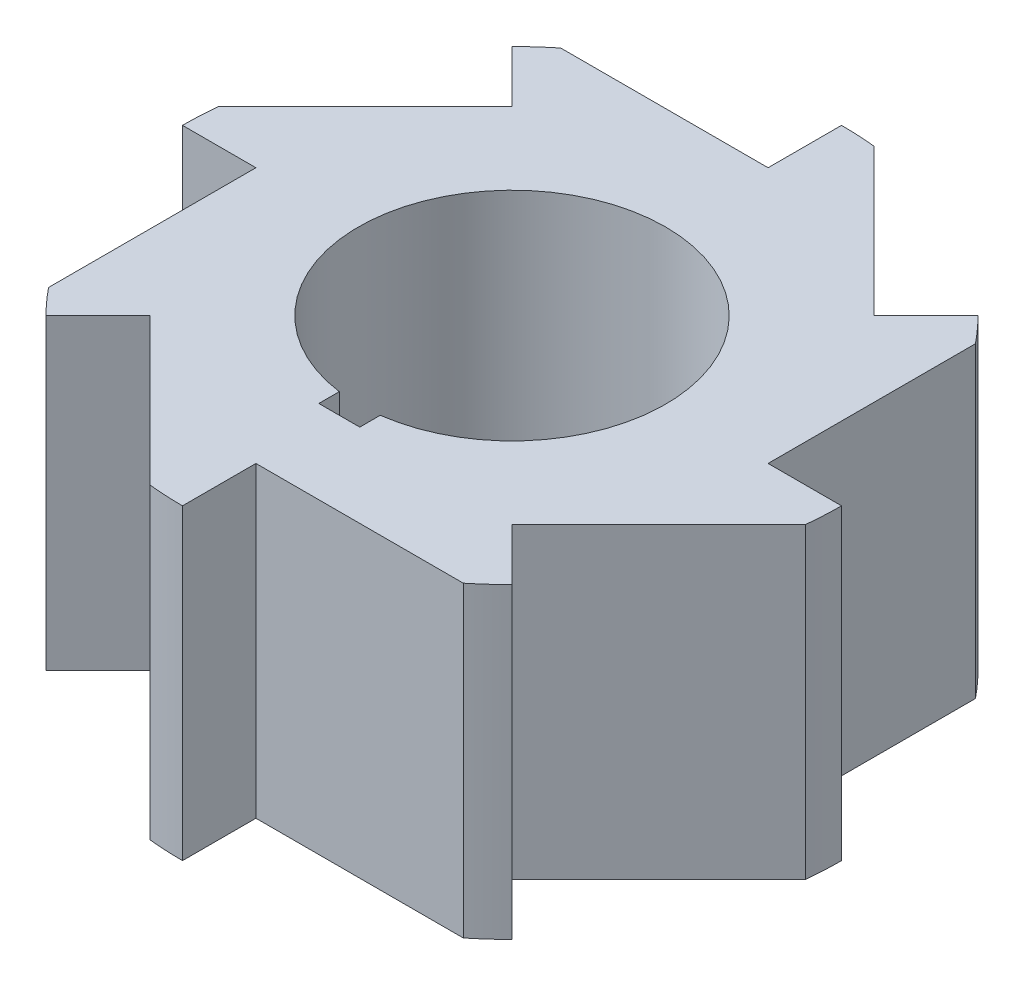
ISO-10303-21;
HEADER;
FILE_DESCRIPTION(('STEP AP214'),'2;1');
FILE_NAME('part.step','',(''),(''),'','','');
FILE_SCHEMA(('AUTOMOTIVE_DESIGN { 1 0 10303 214 1 1 1 1 }'));
ENDSEC;
DATA;
#1=APPLICATION_CONTEXT('core data for automotive mechanical design processes');
#2=APPLICATION_PROTOCOL_DEFINITION('international standard','automotive_design',2000,#1);
#3=PRODUCT_CONTEXT('',#1,'mechanical');
#4=PRODUCT('Part','Part','',(#3));
#5=PRODUCT_RELATED_PRODUCT_CATEGORY('part','',(#4));
#6=PRODUCT_DEFINITION_FORMATION('','',#4);
#7=PRODUCT_DEFINITION_CONTEXT('part definition',#1,'design');
#8=PRODUCT_DEFINITION('design','',#6,#7);
#9=PRODUCT_DEFINITION_SHAPE('','',#8);
#10=(LENGTH_UNIT() NAMED_UNIT(*) SI_UNIT(.MILLI.,.METRE.));
#11=(NAMED_UNIT(*) PLANE_ANGLE_UNIT() SI_UNIT($,.RADIAN.));
#12=(NAMED_UNIT(*) SI_UNIT($,.STERADIAN.) SOLID_ANGLE_UNIT());
#13=UNCERTAINTY_MEASURE_WITH_UNIT(LENGTH_MEASURE(1.E-05),#10,'distance_accuracy_value','');
#14=(GEOMETRIC_REPRESENTATION_CONTEXT(3) GLOBAL_UNCERTAINTY_ASSIGNED_CONTEXT((#13)) GLOBAL_UNIT_ASSIGNED_CONTEXT((#10,
#11,#12)) REPRESENTATION_CONTEXT('',''));
#15=CARTESIAN_POINT('',(0.,0.,0.));
#16=DIRECTION('',(0.,0.,1.));
#17=DIRECTION('',(1.,0.,0.));
#18=AXIS2_PLACEMENT_3D('',#15,#16,#17);
#19=CARTESIAN_POINT('',(0.,30.,0.));
#20=DIRECTION('',(0.,1.,0.));
#21=DIRECTION('',(0.,0.,1.));
#22=AXIS2_PLACEMENT_3D('',#19,#20,#21);
#23=PLANE('',#22);
#24=DIRECTION('',(1.,0.,0.));
#25=VECTOR('',#24,1.);
#26=CARTESIAN_POINT('',(20.2435385717473,30.,25.));
#27=LINE('',#26,#25);
#28=CARTESIAN_POINT('',(0.,30.,25.));
#29=VERTEX_POINT('',#28);
#30=CARTESIAN_POINT('',(20.2435385717473,30.,25.));
#31=VERTEX_POINT('',#30);
#32=EDGE_CURVE('E283',#29,#31,#27,.T.);
#33=ORIENTED_EDGE('',*,*,#32,.T.);
#34=CARTESIAN_POINT('',(0.,30.,0.));
#35=DIRECTION('',(0.,1.,0.));
#36=DIRECTION('',(0.,0.,1.));
#37=AXIS2_PLACEMENT_3D('',#34,#35,#36);
#38=CIRCLE('',#37,32.1683206572215);
#39=CARTESIAN_POINT('',(22.7464376761046,30.,22.7464376761046));
#40=VERTEX_POINT('',#39);
#41=EDGE_CURVE('E287',#31,#40,#38,.T.);
#42=ORIENTED_EDGE('',*,*,#41,.T.);
#43=DIRECTION('',(-0.707106781186548,0.,-0.707106781186547));
#44=VECTOR('',#43,1.);
#45=CARTESIAN_POINT('',(17.6776695296637,30.,17.6776695296637));
#46=LINE('',#45,#44);
#47=CARTESIAN_POINT('',(17.6776695296637,30.,17.6776695296637));
#48=VERTEX_POINT('',#47);
#49=EDGE_CURVE('E291',#40,#48,#46,.T.);
#50=ORIENTED_EDGE('',*,*,#49,.T.);
#51=DIRECTION('',(0.707106781186548,0.,-0.707106781186547));
#52=VECTOR('',#51,1.);
#53=CARTESIAN_POINT('',(31.9920129289576,30.,3.36332613036975));
#54=LINE('',#53,#52);
#55=CARTESIAN_POINT('',(31.9920129289576,30.,3.36332613036975));
#56=VERTEX_POINT('',#55);
#57=EDGE_CURVE('E294',#48,#56,#54,.T.);
#58=ORIENTED_EDGE('',*,*,#57,.T.);
#59=CARTESIAN_POINT('',(0.,30.,0.));
#60=DIRECTION('',(0.,1.,0.));
#61=DIRECTION('',(0.,0.,1.));
#62=AXIS2_PLACEMENT_3D('',#59,#60,#61);
#63=CIRCLE('',#62,32.1683206572215);
#64=CARTESIAN_POINT('',(32.1683206572215,30.,0.));
#65=VERTEX_POINT('',#64);
#66=EDGE_CURVE('E297',#56,#65,#63,.T.);
#67=ORIENTED_EDGE('',*,*,#66,.T.);
#68=DIRECTION('',(-1.,0.,0.));
#69=VECTOR('',#68,1.);
#70=CARTESIAN_POINT('',(25.,30.,0.));
#71=LINE('',#70,#69);
#72=CARTESIAN_POINT('',(25.,30.,0.));
#73=VERTEX_POINT('',#72);
#74=EDGE_CURVE('E300',#65,#73,#71,.T.);
#75=ORIENTED_EDGE('',*,*,#74,.T.);
#76=DIRECTION('',(0.,0.,-1.));
#77=VECTOR('',#76,1.);
#78=CARTESIAN_POINT('',(25.,30.,-20.2435385717473));
#79=LINE('',#78,#77);
#80=CARTESIAN_POINT('',(25.,30.,-20.2435385717473));
#81=VERTEX_POINT('',#80);
#82=EDGE_CURVE('E303',#73,#81,#79,.T.);
#83=ORIENTED_EDGE('',*,*,#82,.T.);
#84=CARTESIAN_POINT('',(0.,30.,0.));
#85=DIRECTION('',(0.,1.,0.));
#86=DIRECTION('',(0.,0.,1.));
#87=AXIS2_PLACEMENT_3D('',#84,#85,#86);
#88=CIRCLE('',#87,32.1683206572215);
#89=CARTESIAN_POINT('',(22.7464376761046,30.,-22.7464376761046));
#90=VERTEX_POINT('',#89);
#91=EDGE_CURVE('E306',#81,#90,#88,.T.);
#92=ORIENTED_EDGE('',*,*,#91,.T.);
#93=DIRECTION('',(-0.707106781186547,0.,0.707106781186549));
#94=VECTOR('',#93,1.);
#95=CARTESIAN_POINT('',(17.6776695296637,30.,-17.6776695296637));
#96=LINE('',#95,#94);
#97=CARTESIAN_POINT('',(17.6776695296637,30.,-17.6776695296637));
#98=VERTEX_POINT('',#97);
#99=EDGE_CURVE('E309',#90,#98,#96,.T.);
#100=ORIENTED_EDGE('',*,*,#99,.T.);
#101=DIRECTION('',(-0.707106781186547,0.,-0.707106781186548));
#102=VECTOR('',#101,1.);
#103=CARTESIAN_POINT('',(3.36332613036975,30.,-31.9920129289576));
#104=LINE('',#103,#102);
#105=CARTESIAN_POINT('',(3.36332613036975,30.,-31.9920129289576));
#106=VERTEX_POINT('',#105);
#107=EDGE_CURVE('E312',#98,#106,#104,.T.);
#108=ORIENTED_EDGE('',*,*,#107,.T.);
#109=CARTESIAN_POINT('',(0.,30.,0.));
#110=DIRECTION('',(0.,1.,0.));
#111=DIRECTION('',(0.,0.,1.));
#112=AXIS2_PLACEMENT_3D('',#109,#110,#111);
#113=CIRCLE('',#112,32.1683206572215);
#114=CARTESIAN_POINT('',(0.,30.,-32.1683206572215));
#115=VERTEX_POINT('',#114);
#116=EDGE_CURVE('E315',#106,#115,#113,.T.);
#117=ORIENTED_EDGE('',*,*,#116,.T.);
#118=DIRECTION('',(0.,0.,1.));
#119=VECTOR('',#118,1.);
#120=CARTESIAN_POINT('',(0.,30.,-25.));
#121=LINE('',#120,#119);
#122=CARTESIAN_POINT('',(0.,30.,-25.));
#123=VERTEX_POINT('',#122);
#124=EDGE_CURVE('E318',#115,#123,#121,.T.);
#125=ORIENTED_EDGE('',*,*,#124,.T.);
#126=DIRECTION('',(-1.,0.,0.));
#127=VECTOR('',#126,1.);
#128=CARTESIAN_POINT('',(-20.2435385717473,30.,-25.));
#129=LINE('',#128,#127);
#130=CARTESIAN_POINT('',(-20.2435385717473,30.,-25.));
#131=VERTEX_POINT('',#130);
#132=EDGE_CURVE('E321',#123,#131,#129,.T.);
#133=ORIENTED_EDGE('',*,*,#132,.T.);
#134=CARTESIAN_POINT('',(0.,30.,0.));
#135=DIRECTION('',(0.,1.,0.));
#136=DIRECTION('',(0.,0.,1.));
#137=AXIS2_PLACEMENT_3D('',#134,#135,#136);
#138=CIRCLE('',#137,32.1683206572215);
#139=CARTESIAN_POINT('',(-22.7464376761046,30.,-22.7464376761046));
#140=VERTEX_POINT('',#139);
#141=EDGE_CURVE('E324',#131,#140,#138,.T.);
#142=ORIENTED_EDGE('',*,*,#141,.T.);
#143=DIRECTION('',(0.707106781186548,0.,0.707106781186547));
#144=VECTOR('',#143,1.);
#145=CARTESIAN_POINT('',(-17.6776695296637,30.,-17.6776695296637));
#146=LINE('',#145,#144);
#147=CARTESIAN_POINT('',(-17.6776695296637,30.,-17.6776695296637));
#148=VERTEX_POINT('',#147);
#149=EDGE_CURVE('E327',#140,#148,#146,.T.);
#150=ORIENTED_EDGE('',*,*,#149,.T.);
#151=DIRECTION('',(-0.707106781186548,0.,0.707106781186547));
#152=VECTOR('',#151,1.);
#153=CARTESIAN_POINT('',(-31.9920129289576,30.,-3.36332613036975));
#154=LINE('',#153,#152);
#155=CARTESIAN_POINT('',(-31.9920129289576,30.,-3.36332613036974));
#156=VERTEX_POINT('',#155);
#157=EDGE_CURVE('E330',#148,#156,#154,.T.);
#158=ORIENTED_EDGE('',*,*,#157,.T.);
#159=CARTESIAN_POINT('',(0.,30.,0.));
#160=DIRECTION('',(0.,1.,0.));
#161=DIRECTION('',(0.,0.,1.));
#162=AXIS2_PLACEMENT_3D('',#159,#160,#161);
#163=CIRCLE('',#162,32.1683206572215);
#164=CARTESIAN_POINT('',(-32.1683206572215,30.,0.));
#165=VERTEX_POINT('',#164);
#166=EDGE_CURVE('E333',#156,#165,#163,.T.);
#167=ORIENTED_EDGE('',*,*,#166,.T.);
#168=DIRECTION('',(1.,0.,0.));
#169=VECTOR('',#168,1.);
#170=CARTESIAN_POINT('',(-25.,30.,0.));
#171=LINE('',#170,#169);
#172=CARTESIAN_POINT('',(-25.,30.,0.));
#173=VERTEX_POINT('',#172);
#174=EDGE_CURVE('E336',#165,#173,#171,.T.);
#175=ORIENTED_EDGE('',*,*,#174,.T.);
#176=DIRECTION('',(0.,0.,1.));
#177=VECTOR('',#176,1.);
#178=CARTESIAN_POINT('',(-25.,30.,20.2435385717473));
#179=LINE('',#178,#177);
#180=CARTESIAN_POINT('',(-25.,30.,20.2435385717473));
#181=VERTEX_POINT('',#180);
#182=EDGE_CURVE('E339',#173,#181,#179,.T.);
#183=ORIENTED_EDGE('',*,*,#182,.T.);
#184=CARTESIAN_POINT('',(0.,30.,0.));
#185=DIRECTION('',(0.,1.,0.));
#186=DIRECTION('',(0.,0.,1.));
#187=AXIS2_PLACEMENT_3D('',#184,#185,#186);
#188=CIRCLE('',#187,32.1683206572215);
#189=CARTESIAN_POINT('',(-22.7464376761046,30.,22.7464376761046));
#190=VERTEX_POINT('',#189);
#191=EDGE_CURVE('E342',#181,#190,#188,.T.);
#192=ORIENTED_EDGE('',*,*,#191,.T.);
#193=DIRECTION('',(0.707106781186545,0.,-0.70710678118655));
#194=VECTOR('',#193,1.);
#195=CARTESIAN_POINT('',(-17.6776695296637,30.,17.6776695296637));
#196=LINE('',#195,#194);
#197=CARTESIAN_POINT('',(-17.6776695296637,30.,17.6776695296637));
#198=VERTEX_POINT('',#197);
#199=EDGE_CURVE('E345',#190,#198,#196,.T.);
#200=ORIENTED_EDGE('',*,*,#199,.T.);
#201=DIRECTION('',(0.707106781186547,0.,0.707106781186548));
#202=VECTOR('',#201,1.);
#203=CARTESIAN_POINT('',(-3.36332613036975,30.,31.9920129289576));
#204=LINE('',#203,#202);
#205=CARTESIAN_POINT('',(-3.36332613036974,30.,31.9920129289576));
#206=VERTEX_POINT('',#205);
#207=EDGE_CURVE('E348',#198,#206,#204,.T.);
#208=ORIENTED_EDGE('',*,*,#207,.T.);
#209=CARTESIAN_POINT('',(0.,30.,0.));
#210=DIRECTION('',(0.,1.,0.));
#211=DIRECTION('',(0.,0.,1.));
#212=AXIS2_PLACEMENT_3D('',#209,#210,#211);
#213=CIRCLE('',#212,32.1683206572215);
#214=CARTESIAN_POINT('',(0.,30.,32.1683206572215));
#215=VERTEX_POINT('',#214);
#216=EDGE_CURVE('E351',#206,#215,#213,.T.);
#217=ORIENTED_EDGE('',*,*,#216,.T.);
#218=DIRECTION('',(0.,0.,-1.));
#219=VECTOR('',#218,1.);
#220=CARTESIAN_POINT('',(0.,30.,25.));
#221=LINE('',#220,#219);
#222=EDGE_CURVE('E354',#215,#29,#221,.T.);
#223=ORIENTED_EDGE('',*,*,#222,.T.);
#224=EDGE_LOOP('',(#33,#42,#50,#58,#67,#75,#83,#92,#100,#108,#117,#125,#133,#142,#150,#158,#167,
#175,#183,#192,#200,#208,#217,#223));
#225=FACE_BOUND('',#224,.T.);
#226=DIRECTION('',(0.,0.,-1.));
#227=VECTOR('',#226,1.);
#228=CARTESIAN_POINT('',(2.,30.,16.8607427142418));
#229=LINE('',#228,#227);
#230=CARTESIAN_POINT('',(2.,30.,16.8607427142418));
#231=VERTEX_POINT('',#230);
#232=CARTESIAN_POINT('',(2.,30.,14.8607427142417));
#233=VERTEX_POINT('',#232);
#234=EDGE_CURVE('E244',#231,#233,#229,.T.);
#235=ORIENTED_EDGE('',*,*,#234,.F.);
#236=DIRECTION('',(1.,0.,0.));
#237=VECTOR('',#236,1.);
#238=CARTESIAN_POINT('',(-2.,30.,16.8607427142418));
#239=LINE('',#238,#237);
#240=CARTESIAN_POINT('',(-2.,30.,16.8607427142418));
#241=VERTEX_POINT('',#240);
#242=EDGE_CURVE('E235',#241,#231,#239,.T.);
#243=ORIENTED_EDGE('',*,*,#242,.F.);
#244=DIRECTION('',(0.,0.,1.));
#245=VECTOR('',#244,1.);
#246=CARTESIAN_POINT('',(-2.,30.,16.8607427142418));
#247=LINE('',#246,#245);
#248=CARTESIAN_POINT('',(-2.,30.,14.8607427142418));
#249=VERTEX_POINT('',#248);
#250=EDGE_CURVE('E261',#249,#241,#247,.T.);
#251=ORIENTED_EDGE('',*,*,#250,.F.);
#252=CARTESIAN_POINT('',(0.,30.,0.));
#253=DIRECTION('',(0.,1.,0.));
#254=DIRECTION('',(0.,0.,1.));
#255=AXIS2_PLACEMENT_3D('',#252,#253,#254);
#256=CIRCLE('',#255,14.9947215385578);
#257=EDGE_CURVE('E257',#233,#249,#256,.T.);
#258=ORIENTED_EDGE('',*,*,#257,.F.);
#259=EDGE_LOOP('',(#235,#243,#251,#258));
#260=FACE_BOUND('',#259,.T.);
#261=ADVANCED_FACE('F49',(#225,#260),#23,.T.);
#262=CARTESIAN_POINT('',(0.,0.,0.));
#263=DIRECTION('',(0.,1.,0.));
#264=DIRECTION('',(0.,0.,1.));
#265=AXIS2_PLACEMENT_3D('',#262,#263,#264);
#266=PLANE('',#265);
#267=DIRECTION('',(1.,0.,0.));
#268=VECTOR('',#267,1.);
#269=CARTESIAN_POINT('',(20.2435385717473,0.,25.));
#270=LINE('',#269,#268);
#271=CARTESIAN_POINT('',(0.,0.,25.));
#272=VERTEX_POINT('',#271);
#273=CARTESIAN_POINT('',(20.2435385717473,0.,25.));
#274=VERTEX_POINT('',#273);
#275=EDGE_CURVE('E253',#272,#274,#270,.T.);
#276=ORIENTED_EDGE('',*,*,#275,.F.);
#277=DIRECTION('',(0.,0.,-1.));
#278=VECTOR('',#277,1.);
#279=CARTESIAN_POINT('',(0.,0.,25.));
#280=LINE('',#279,#278);
#281=CARTESIAN_POINT('',(0.,0.,32.1683206572215));
#282=VERTEX_POINT('',#281);
#283=EDGE_CURVE('E288',#282,#272,#280,.T.);
#284=ORIENTED_EDGE('',*,*,#283,.F.);
#285=CARTESIAN_POINT('',(0.,0.,0.));
#286=DIRECTION('',(0.,1.,0.));
#287=DIRECTION('',(0.,0.,1.));
#288=AXIS2_PLACEMENT_3D('',#285,#286,#287);
#289=CIRCLE('',#288,32.1683206572215);
#290=CARTESIAN_POINT('',(-3.36332613036974,0.,31.9920129289576));
#291=VERTEX_POINT('',#290);
#292=EDGE_CURVE('E424',#291,#282,#289,.T.);
#293=ORIENTED_EDGE('',*,*,#292,.F.);
#294=DIRECTION('',(0.707106781186547,0.,0.707106781186548));
#295=VECTOR('',#294,1.);
#296=CARTESIAN_POINT('',(-3.36332613036975,0.,31.9920129289576));
#297=LINE('',#296,#295);
#298=CARTESIAN_POINT('',(-17.6776695296637,0.,17.6776695296637));
#299=VERTEX_POINT('',#298);
#300=EDGE_CURVE('E421',#299,#291,#297,.T.);
#301=ORIENTED_EDGE('',*,*,#300,.F.);
#302=DIRECTION('',(0.707106781186545,0.,-0.70710678118655));
#303=VECTOR('',#302,1.);
#304=CARTESIAN_POINT('',(-17.6776695296637,0.,17.6776695296637));
#305=LINE('',#304,#303);
#306=CARTESIAN_POINT('',(-22.7464376761046,0.,22.7464376761046));
#307=VERTEX_POINT('',#306);
#308=EDGE_CURVE('E418',#307,#299,#305,.T.);
#309=ORIENTED_EDGE('',*,*,#308,.F.);
#310=CARTESIAN_POINT('',(0.,0.,0.));
#311=DIRECTION('',(0.,1.,0.));
#312=DIRECTION('',(0.,0.,1.));
#313=AXIS2_PLACEMENT_3D('',#310,#311,#312);
#314=CIRCLE('',#313,32.1683206572215);
#315=CARTESIAN_POINT('',(-25.,0.,20.2435385717473));
#316=VERTEX_POINT('',#315);
#317=EDGE_CURVE('E415',#316,#307,#314,.T.);
#318=ORIENTED_EDGE('',*,*,#317,.F.);
#319=DIRECTION('',(0.,0.,1.));
#320=VECTOR('',#319,1.);
#321=CARTESIAN_POINT('',(-25.,0.,20.2435385717473));
#322=LINE('',#321,#320);
#323=CARTESIAN_POINT('',(-25.,0.,0.));
#324=VERTEX_POINT('',#323);
#325=EDGE_CURVE('E412',#324,#316,#322,.T.);
#326=ORIENTED_EDGE('',*,*,#325,.F.);
#327=DIRECTION('',(1.,0.,0.));
#328=VECTOR('',#327,1.);
#329=CARTESIAN_POINT('',(-25.,0.,0.));
#330=LINE('',#329,#328);
#331=CARTESIAN_POINT('',(-32.1683206572215,0.,0.));
#332=VERTEX_POINT('',#331);
#333=EDGE_CURVE('E409',#332,#324,#330,.T.);
#334=ORIENTED_EDGE('',*,*,#333,.F.);
#335=CARTESIAN_POINT('',(0.,0.,0.));
#336=DIRECTION('',(0.,1.,0.));
#337=DIRECTION('',(0.,0.,1.));
#338=AXIS2_PLACEMENT_3D('',#335,#336,#337);
#339=CIRCLE('',#338,32.1683206572215);
#340=CARTESIAN_POINT('',(-31.9920129289576,0.,-3.36332613036974));
#341=VERTEX_POINT('',#340);
#342=EDGE_CURVE('E406',#341,#332,#339,.T.);
#343=ORIENTED_EDGE('',*,*,#342,.F.);
#344=DIRECTION('',(-0.707106781186548,0.,0.707106781186547));
#345=VECTOR('',#344,1.);
#346=CARTESIAN_POINT('',(-31.9920129289576,0.,-3.36332613036975));
#347=LINE('',#346,#345);
#348=CARTESIAN_POINT('',(-17.6776695296637,0.,-17.6776695296637));
#349=VERTEX_POINT('',#348);
#350=EDGE_CURVE('E403',#349,#341,#347,.T.);
#351=ORIENTED_EDGE('',*,*,#350,.F.);
#352=DIRECTION('',(0.707106781186548,0.,0.707106781186547));
#353=VECTOR('',#352,1.);
#354=CARTESIAN_POINT('',(-17.6776695296637,0.,-17.6776695296637));
#355=LINE('',#354,#353);
#356=CARTESIAN_POINT('',(-22.7464376761046,0.,-22.7464376761046));
#357=VERTEX_POINT('',#356);
#358=EDGE_CURVE('E400',#357,#349,#355,.T.);
#359=ORIENTED_EDGE('',*,*,#358,.F.);
#360=CARTESIAN_POINT('',(0.,0.,0.));
#361=DIRECTION('',(0.,1.,0.));
#362=DIRECTION('',(0.,0.,1.));
#363=AXIS2_PLACEMENT_3D('',#360,#361,#362);
#364=CIRCLE('',#363,32.1683206572215);
#365=CARTESIAN_POINT('',(-20.2435385717473,0.,-25.));
#366=VERTEX_POINT('',#365);
#367=EDGE_CURVE('E397',#366,#357,#364,.T.);
#368=ORIENTED_EDGE('',*,*,#367,.F.);
#369=DIRECTION('',(-1.,0.,0.));
#370=VECTOR('',#369,1.);
#371=CARTESIAN_POINT('',(-20.2435385717473,0.,-25.));
#372=LINE('',#371,#370);
#373=CARTESIAN_POINT('',(0.,0.,-25.));
#374=VERTEX_POINT('',#373);
#375=EDGE_CURVE('E394',#374,#366,#372,.T.);
#376=ORIENTED_EDGE('',*,*,#375,.F.);
#377=DIRECTION('',(0.,0.,1.));
#378=VECTOR('',#377,1.);
#379=CARTESIAN_POINT('',(0.,0.,-25.));
#380=LINE('',#379,#378);
#381=CARTESIAN_POINT('',(0.,0.,-32.1683206572215));
#382=VERTEX_POINT('',#381);
#383=EDGE_CURVE('E391',#382,#374,#380,.T.);
#384=ORIENTED_EDGE('',*,*,#383,.F.);
#385=CARTESIAN_POINT('',(0.,0.,0.));
#386=DIRECTION('',(0.,1.,0.));
#387=DIRECTION('',(0.,0.,1.));
#388=AXIS2_PLACEMENT_3D('',#385,#386,#387);
#389=CIRCLE('',#388,32.1683206572215);
#390=CARTESIAN_POINT('',(3.36332613036975,0.,-31.9920129289576));
#391=VERTEX_POINT('',#390);
#392=EDGE_CURVE('E388',#391,#382,#389,.T.);
#393=ORIENTED_EDGE('',*,*,#392,.F.);
#394=DIRECTION('',(-0.707106781186547,0.,-0.707106781186548));
#395=VECTOR('',#394,1.);
#396=CARTESIAN_POINT('',(3.36332613036975,0.,-31.9920129289576));
#397=LINE('',#396,#395);
#398=CARTESIAN_POINT('',(17.6776695296637,0.,-17.6776695296637));
#399=VERTEX_POINT('',#398);
#400=EDGE_CURVE('E385',#399,#391,#397,.T.);
#401=ORIENTED_EDGE('',*,*,#400,.F.);
#402=DIRECTION('',(-0.707106781186547,0.,0.707106781186549));
#403=VECTOR('',#402,1.);
#404=CARTESIAN_POINT('',(17.6776695296637,0.,-17.6776695296637));
#405=LINE('',#404,#403);
#406=CARTESIAN_POINT('',(22.7464376761046,0.,-22.7464376761046));
#407=VERTEX_POINT('',#406);
#408=EDGE_CURVE('E382',#407,#399,#405,.T.);
#409=ORIENTED_EDGE('',*,*,#408,.F.);
#410=CARTESIAN_POINT('',(0.,0.,0.));
#411=DIRECTION('',(0.,1.,0.));
#412=DIRECTION('',(0.,0.,1.));
#413=AXIS2_PLACEMENT_3D('',#410,#411,#412);
#414=CIRCLE('',#413,32.1683206572215);
#415=CARTESIAN_POINT('',(25.,0.,-20.2435385717473));
#416=VERTEX_POINT('',#415);
#417=EDGE_CURVE('E379',#416,#407,#414,.T.);
#418=ORIENTED_EDGE('',*,*,#417,.F.);
#419=DIRECTION('',(0.,0.,-1.));
#420=VECTOR('',#419,1.);
#421=CARTESIAN_POINT('',(25.,0.,-20.2435385717473));
#422=LINE('',#421,#420);
#423=CARTESIAN_POINT('',(25.,0.,0.));
#424=VERTEX_POINT('',#423);
#425=EDGE_CURVE('E376',#424,#416,#422,.T.);
#426=ORIENTED_EDGE('',*,*,#425,.F.);
#427=DIRECTION('',(-1.,0.,0.));
#428=VECTOR('',#427,1.);
#429=CARTESIAN_POINT('',(25.,0.,0.));
#430=LINE('',#429,#428);
#431=CARTESIAN_POINT('',(32.1683206572215,0.,0.));
#432=VERTEX_POINT('',#431);
#433=EDGE_CURVE('E373',#432,#424,#430,.T.);
#434=ORIENTED_EDGE('',*,*,#433,.F.);
#435=CARTESIAN_POINT('',(0.,0.,0.));
#436=DIRECTION('',(0.,1.,0.));
#437=DIRECTION('',(0.,0.,1.));
#438=AXIS2_PLACEMENT_3D('',#435,#436,#437);
#439=CIRCLE('',#438,32.1683206572215);
#440=CARTESIAN_POINT('',(31.9920129289576,0.,3.36332613036975));
#441=VERTEX_POINT('',#440);
#442=EDGE_CURVE('E370',#441,#432,#439,.T.);
#443=ORIENTED_EDGE('',*,*,#442,.F.);
#444=DIRECTION('',(0.707106781186548,0.,-0.707106781186547));
#445=VECTOR('',#444,1.);
#446=CARTESIAN_POINT('',(31.9920129289576,0.,3.36332613036975));
#447=LINE('',#446,#445);
#448=CARTESIAN_POINT('',(17.6776695296637,0.,17.6776695296637));
#449=VERTEX_POINT('',#448);
#450=EDGE_CURVE('E367',#449,#441,#447,.T.);
#451=ORIENTED_EDGE('',*,*,#450,.F.);
#452=DIRECTION('',(-0.707106781186548,0.,-0.707106781186547));
#453=VECTOR('',#452,1.);
#454=CARTESIAN_POINT('',(17.6776695296637,0.,17.6776695296637));
#455=LINE('',#454,#453);
#456=CARTESIAN_POINT('',(22.7464376761046,0.,22.7464376761046));
#457=VERTEX_POINT('',#456);
#458=EDGE_CURVE('E364',#457,#449,#455,.T.);
#459=ORIENTED_EDGE('',*,*,#458,.F.);
#460=CARTESIAN_POINT('',(0.,0.,0.));
#461=DIRECTION('',(0.,1.,0.));
#462=DIRECTION('',(0.,0.,1.));
#463=AXIS2_PLACEMENT_3D('',#460,#461,#462);
#464=CIRCLE('',#463,32.1683206572215);
#465=EDGE_CURVE('E361',#274,#457,#464,.T.);
#466=ORIENTED_EDGE('',*,*,#465,.F.);
#467=EDGE_LOOP('',(#276,#284,#293,#301,#309,#318,#326,#334,#343,#351,#359,#368,#376,#384,#393,
#401,#409,#418,#426,#434,#443,#451,#459,#466));
#468=FACE_BOUND('',#467,.T.);
#469=DIRECTION('',(1.,0.,0.));
#470=VECTOR('',#469,1.);
#471=CARTESIAN_POINT('',(-2.,0.,16.8607427142418));
#472=LINE('',#471,#470);
#473=CARTESIAN_POINT('',(-2.,0.,16.8607427142418));
#474=VERTEX_POINT('',#473);
#475=CARTESIAN_POINT('',(2.,0.,16.8607427142418));
#476=VERTEX_POINT('',#475);
#477=EDGE_CURVE('E73',#474,#476,#472,.T.);
#478=ORIENTED_EDGE('',*,*,#477,.T.);
#479=DIRECTION('',(0.,0.,-1.));
#480=VECTOR('',#479,1.);
#481=CARTESIAN_POINT('',(2.,0.,16.8607427142418));
#482=LINE('',#481,#480);
#483=CARTESIAN_POINT('',(2.,0.,14.8607427142417));
#484=VERTEX_POINT('',#483);
#485=EDGE_CURVE('E251',#476,#484,#482,.T.);
#486=ORIENTED_EDGE('',*,*,#485,.T.);
#487=CARTESIAN_POINT('',(0.,0.,0.));
#488=DIRECTION('',(0.,1.,0.));
#489=DIRECTION('',(0.,0.,1.));
#490=AXIS2_PLACEMENT_3D('',#487,#488,#489);
#491=CIRCLE('',#490,14.9947215385578);
#492=CARTESIAN_POINT('',(-2.,0.,14.8607427142418));
#493=VERTEX_POINT('',#492);
#494=EDGE_CURVE('E270',#484,#493,#491,.T.);
#495=ORIENTED_EDGE('',*,*,#494,.T.);
#496=DIRECTION('',(0.,0.,1.));
#497=VECTOR('',#496,1.);
#498=CARTESIAN_POINT('',(-2.,0.,16.8607427142418));
#499=LINE('',#498,#497);
#500=EDGE_CURVE('E245',#493,#474,#499,.T.);
#501=ORIENTED_EDGE('',*,*,#500,.T.);
#502=EDGE_LOOP('',(#478,#486,#495,#501));
#503=FACE_BOUND('',#502,.T.);
#504=ADVANCED_FACE('F527',(#468,#503),#266,.F.);
#505=CARTESIAN_POINT('',(20.2435385717473,30.,25.));
#506=DIRECTION('',(0.,0.,-1.));
#507=DIRECTION('',(-1.,0.,0.));
#508=AXIS2_PLACEMENT_3D('',#505,#506,#507);
#509=PLANE('',#508);
#510=ORIENTED_EDGE('',*,*,#275,.T.);
#511=DIRECTION('',(0.,-1.,0.));
#512=VECTOR('',#511,1.);
#513=CARTESIAN_POINT('',(20.2435385717473,30.,25.));
#514=LINE('',#513,#512);
#515=EDGE_CURVE('E13',#31,#274,#514,.T.);
#516=ORIENTED_EDGE('',*,*,#515,.F.);
#517=ORIENTED_EDGE('',*,*,#32,.F.);
#518=DIRECTION('',(0.,-1.,0.));
#519=VECTOR('',#518,1.);
#520=CARTESIAN_POINT('',(0.,30.,25.));
#521=LINE('',#520,#519);
#522=EDGE_CURVE('E357',#29,#272,#521,.T.);
#523=ORIENTED_EDGE('',*,*,#522,.T.);
#524=EDGE_LOOP('',(#510,#516,#517,#523));
#525=FACE_BOUND('',#524,.T.);
#526=ADVANCED_FACE('F51',(#525),#509,.F.);
#527=CARTESIAN_POINT('',(0.,30.,0.));
#528=DIRECTION('',(0.,-1.,0.));
#529=DIRECTION('',(0.,0.,-1.));
#530=AXIS2_PLACEMENT_3D('',#527,#528,#529);
#531=CYLINDRICAL_SURFACE('',#530,32.1683206572215);
#532=ORIENTED_EDGE('',*,*,#465,.T.);
#533=DIRECTION('',(0.,-1.,0.));
#534=VECTOR('',#533,1.);
#535=CARTESIAN_POINT('',(22.7464376761046,30.,22.7464376761046));
#536=LINE('',#535,#534);
#537=EDGE_CURVE('E58',#40,#457,#536,.T.);
#538=ORIENTED_EDGE('',*,*,#537,.F.);
#539=ORIENTED_EDGE('',*,*,#41,.F.);
#540=ORIENTED_EDGE('',*,*,#515,.T.);
#541=EDGE_LOOP('',(#532,#538,#539,#540));
#542=FACE_BOUND('',#541,.T.);
#543=ADVANCED_FACE('F544',(#542),#531,.T.);
#544=CARTESIAN_POINT('',(17.6776695296637,30.,17.6776695296637));
#545=DIRECTION('',(-0.707106781186547,0.,0.707106781186548));
#546=DIRECTION('',(0.707106781186548,0.,0.707106781186547));
#547=AXIS2_PLACEMENT_3D('',#544,#545,#546);
#548=PLANE('',#547);
#549=ORIENTED_EDGE('',*,*,#458,.T.);
#550=DIRECTION('',(0.,-1.,0.));
#551=VECTOR('',#550,1.);
#552=CARTESIAN_POINT('',(17.6776695296637,30.,17.6776695296637));
#553=LINE('',#552,#551);
#554=EDGE_CURVE('E512',#48,#449,#553,.T.);
#555=ORIENTED_EDGE('',*,*,#554,.F.);
#556=ORIENTED_EDGE('',*,*,#49,.F.);
#557=ORIENTED_EDGE('',*,*,#537,.T.);
#558=EDGE_LOOP('',(#549,#555,#556,#557));
#559=FACE_BOUND('',#558,.T.);
#560=ADVANCED_FACE('F521',(#559),#548,.F.);
#561=CARTESIAN_POINT('',(31.9920129289576,30.,3.36332613036975));
#562=DIRECTION('',(-0.707106781186547,0.,-0.707106781186548));
#563=DIRECTION('',(-0.707106781186548,0.,0.707106781186547));
#564=AXIS2_PLACEMENT_3D('',#561,#562,#563);
#565=PLANE('',#564);
#566=ORIENTED_EDGE('',*,*,#450,.T.);
#567=DIRECTION('',(0.,-1.,0.));
#568=VECTOR('',#567,1.);
#569=CARTESIAN_POINT('',(31.9920129289576,30.,3.36332613036975));
#570=LINE('',#569,#568);
#571=EDGE_CURVE('E508',#56,#441,#570,.T.);
#572=ORIENTED_EDGE('',*,*,#571,.F.);
#573=ORIENTED_EDGE('',*,*,#57,.F.);
#574=ORIENTED_EDGE('',*,*,#554,.T.);
#575=EDGE_LOOP('',(#566,#572,#573,#574));
#576=FACE_BOUND('',#575,.T.);
#577=ADVANCED_FACE('F533',(#576),#565,.F.);
#578=CARTESIAN_POINT('',(0.,30.,0.));
#579=DIRECTION('',(0.,-1.,0.));
#580=DIRECTION('',(0.,0.,-1.));
#581=AXIS2_PLACEMENT_3D('',#578,#579,#580);
#582=CYLINDRICAL_SURFACE('',#581,32.1683206572215);
#583=ORIENTED_EDGE('',*,*,#442,.T.);
#584=DIRECTION('',(0.,-1.,0.));
#585=VECTOR('',#584,1.);
#586=CARTESIAN_POINT('',(32.1683206572215,30.,0.));
#587=LINE('',#586,#585);
#588=EDGE_CURVE('E504',#65,#432,#587,.T.);
#589=ORIENTED_EDGE('',*,*,#588,.F.);
#590=ORIENTED_EDGE('',*,*,#66,.F.);
#591=ORIENTED_EDGE('',*,*,#571,.T.);
#592=EDGE_LOOP('',(#583,#589,#590,#591));
#593=FACE_BOUND('',#592,.T.);
#594=ADVANCED_FACE('F537',(#593),#582,.T.);
#595=CARTESIAN_POINT('',(25.,30.,0.));
#596=DIRECTION('',(0.,0.,1.));
#597=DIRECTION('',(1.,0.,0.));
#598=AXIS2_PLACEMENT_3D('',#595,#596,#597);
#599=PLANE('',#598);
#600=ORIENTED_EDGE('',*,*,#433,.T.);
#601=DIRECTION('',(0.,-1.,0.));
#602=VECTOR('',#601,1.);
#603=CARTESIAN_POINT('',(25.,30.,0.));
#604=LINE('',#603,#602);
#605=EDGE_CURVE('E500',#73,#424,#604,.T.);
#606=ORIENTED_EDGE('',*,*,#605,.F.);
#607=ORIENTED_EDGE('',*,*,#74,.F.);
#608=ORIENTED_EDGE('',*,*,#588,.T.);
#609=EDGE_LOOP('',(#600,#606,#607,#608));
#610=FACE_BOUND('',#609,.T.);
#611=ADVANCED_FACE('F637',(#610),#599,.F.);
#612=CARTESIAN_POINT('',(25.,30.,-20.2435385717473));
#613=DIRECTION('',(-1.,0.,0.));
#614=DIRECTION('',(0.,0.,1.));
#615=AXIS2_PLACEMENT_3D('',#612,#613,#614);
#616=PLANE('',#615);
#617=ORIENTED_EDGE('',*,*,#425,.T.);
#618=DIRECTION('',(0.,-1.,0.));
#619=VECTOR('',#618,1.);
#620=CARTESIAN_POINT('',(25.,30.,-20.2435385717473));
#621=LINE('',#620,#619);
#622=EDGE_CURVE('E496',#81,#416,#621,.T.);
#623=ORIENTED_EDGE('',*,*,#622,.F.);
#624=ORIENTED_EDGE('',*,*,#82,.F.);
#625=ORIENTED_EDGE('',*,*,#605,.T.);
#626=EDGE_LOOP('',(#617,#623,#624,#625));
#627=FACE_BOUND('',#626,.T.);
#628=ADVANCED_FACE('F635',(#627),#616,.F.);
#629=CARTESIAN_POINT('',(0.,30.,0.));
#630=DIRECTION('',(0.,-1.,0.));
#631=DIRECTION('',(0.,0.,-1.));
#632=AXIS2_PLACEMENT_3D('',#629,#630,#631);
#633=CYLINDRICAL_SURFACE('',#632,32.1683206572215);
#634=ORIENTED_EDGE('',*,*,#417,.T.);
#635=DIRECTION('',(0.,-1.,0.));
#636=VECTOR('',#635,1.);
#637=CARTESIAN_POINT('',(22.7464376761046,30.,-22.7464376761046));
#638=LINE('',#637,#636);
#639=EDGE_CURVE('E492',#90,#407,#638,.T.);
#640=ORIENTED_EDGE('',*,*,#639,.F.);
#641=ORIENTED_EDGE('',*,*,#91,.F.);
#642=ORIENTED_EDGE('',*,*,#622,.T.);
#643=EDGE_LOOP('',(#634,#640,#641,#642));
#644=FACE_BOUND('',#643,.T.);
#645=ADVANCED_FACE('F631',(#644),#633,.T.);
#646=CARTESIAN_POINT('',(17.6776695296637,30.,-17.6776695296637));
#647=DIRECTION('',(0.707106781186549,0.,0.707106781186547));
#648=DIRECTION('',(0.707106781186547,0.,-0.707106781186549));
#649=AXIS2_PLACEMENT_3D('',#646,#647,#648);
#650=PLANE('',#649);
#651=ORIENTED_EDGE('',*,*,#408,.T.);
#652=DIRECTION('',(0.,-1.,0.));
#653=VECTOR('',#652,1.);
#654=CARTESIAN_POINT('',(17.6776695296637,30.,-17.6776695296637));
#655=LINE('',#654,#653);
#656=EDGE_CURVE('E488',#98,#399,#655,.T.);
#657=ORIENTED_EDGE('',*,*,#656,.F.);
#658=ORIENTED_EDGE('',*,*,#99,.F.);
#659=ORIENTED_EDGE('',*,*,#639,.T.);
#660=EDGE_LOOP('',(#651,#657,#658,#659));
#661=FACE_BOUND('',#660,.T.);
#662=ADVANCED_FACE('F626',(#661),#650,.F.);
#663=CARTESIAN_POINT('',(3.36332613036975,30.,-31.9920129289576));
#664=DIRECTION('',(-0.707106781186548,0.,0.707106781186547));
#665=DIRECTION('',(0.707106781186547,0.,0.707106781186548));
#666=AXIS2_PLACEMENT_3D('',#663,#664,#665);
#667=PLANE('',#666);
#668=ORIENTED_EDGE('',*,*,#400,.T.);
#669=DIRECTION('',(0.,-1.,0.));
#670=VECTOR('',#669,1.);
#671=CARTESIAN_POINT('',(3.36332613036975,30.,-31.9920129289576));
#672=LINE('',#671,#670);
#673=EDGE_CURVE('E484',#106,#391,#672,.T.);
#674=ORIENTED_EDGE('',*,*,#673,.F.);
#675=ORIENTED_EDGE('',*,*,#107,.F.);
#676=ORIENTED_EDGE('',*,*,#656,.T.);
#677=EDGE_LOOP('',(#668,#674,#675,#676));
#678=FACE_BOUND('',#677,.T.);
#679=ADVANCED_FACE('F620',(#678),#667,.F.);
#680=CARTESIAN_POINT('',(0.,30.,0.));
#681=DIRECTION('',(0.,-1.,0.));
#682=DIRECTION('',(0.,0.,-1.));
#683=AXIS2_PLACEMENT_3D('',#680,#681,#682);
#684=CYLINDRICAL_SURFACE('',#683,32.1683206572215);
#685=ORIENTED_EDGE('',*,*,#392,.T.);
#686=DIRECTION('',(0.,-1.,0.));
#687=VECTOR('',#686,1.);
#688=CARTESIAN_POINT('',(0.,30.,-32.1683206572215));
#689=LINE('',#688,#687);
#690=EDGE_CURVE('E480',#115,#382,#689,.T.);
#691=ORIENTED_EDGE('',*,*,#690,.F.);
#692=ORIENTED_EDGE('',*,*,#116,.F.);
#693=ORIENTED_EDGE('',*,*,#673,.T.);
#694=EDGE_LOOP('',(#685,#691,#692,#693));
#695=FACE_BOUND('',#694,.T.);
#696=ADVANCED_FACE('F616',(#695),#684,.T.);
#697=CARTESIAN_POINT('',(0.,30.,-25.));
#698=DIRECTION('',(1.,0.,0.));
#699=DIRECTION('',(0.,0.,-1.));
#700=AXIS2_PLACEMENT_3D('',#697,#698,#699);
#701=PLANE('',#700);
#702=ORIENTED_EDGE('',*,*,#383,.T.);
#703=DIRECTION('',(0.,-1.,0.));
#704=VECTOR('',#703,1.);
#705=CARTESIAN_POINT('',(0.,30.,-25.));
#706=LINE('',#705,#704);
#707=EDGE_CURVE('E476',#123,#374,#706,.T.);
#708=ORIENTED_EDGE('',*,*,#707,.F.);
#709=ORIENTED_EDGE('',*,*,#124,.F.);
#710=ORIENTED_EDGE('',*,*,#690,.T.);
#711=EDGE_LOOP('',(#702,#708,#709,#710));
#712=FACE_BOUND('',#711,.T.);
#713=ADVANCED_FACE('F611',(#712),#701,.F.);
#714=CARTESIAN_POINT('',(-20.2435385717473,30.,-25.));
#715=DIRECTION('',(0.,0.,1.));
#716=DIRECTION('',(1.,0.,0.));
#717=AXIS2_PLACEMENT_3D('',#714,#715,#716);
#718=PLANE('',#717);
#719=ORIENTED_EDGE('',*,*,#375,.T.);
#720=DIRECTION('',(0.,-1.,0.));
#721=VECTOR('',#720,1.);
#722=CARTESIAN_POINT('',(-20.2435385717473,30.,-25.));
#723=LINE('',#722,#721);
#724=EDGE_CURVE('E472',#131,#366,#723,.T.);
#725=ORIENTED_EDGE('',*,*,#724,.F.);
#726=ORIENTED_EDGE('',*,*,#132,.F.);
#727=ORIENTED_EDGE('',*,*,#707,.T.);
#728=EDGE_LOOP('',(#719,#725,#726,#727));
#729=FACE_BOUND('',#728,.T.);
#730=ADVANCED_FACE('F605',(#729),#718,.F.);
#731=CARTESIAN_POINT('',(0.,30.,0.));
#732=DIRECTION('',(0.,-1.,0.));
#733=DIRECTION('',(0.,0.,-1.));
#734=AXIS2_PLACEMENT_3D('',#731,#732,#733);
#735=CYLINDRICAL_SURFACE('',#734,32.1683206572215);
#736=ORIENTED_EDGE('',*,*,#367,.T.);
#737=DIRECTION('',(0.,-1.,0.));
#738=VECTOR('',#737,1.);
#739=CARTESIAN_POINT('',(-22.7464376761046,30.,-22.7464376761046));
#740=LINE('',#739,#738);
#741=EDGE_CURVE('E468',#140,#357,#740,.T.);
#742=ORIENTED_EDGE('',*,*,#741,.F.);
#743=ORIENTED_EDGE('',*,*,#141,.F.);
#744=ORIENTED_EDGE('',*,*,#724,.T.);
#745=EDGE_LOOP('',(#736,#742,#743,#744));
#746=FACE_BOUND('',#745,.T.);
#747=ADVANCED_FACE('F601',(#746),#735,.T.);
#748=CARTESIAN_POINT('',(-17.6776695296637,30.,-17.6776695296637));
#749=DIRECTION('',(0.707106781186547,0.,-0.707106781186549));
#750=DIRECTION('',(-0.707106781186549,0.,-0.707106781186547));
#751=AXIS2_PLACEMENT_3D('',#748,#749,#750);
#752=PLANE('',#751);
#753=ORIENTED_EDGE('',*,*,#358,.T.);
#754=DIRECTION('',(0.,-1.,0.));
#755=VECTOR('',#754,1.);
#756=CARTESIAN_POINT('',(-17.6776695296637,30.,-17.6776695296637));
#757=LINE('',#756,#755);
#758=EDGE_CURVE('E464',#148,#349,#757,.T.);
#759=ORIENTED_EDGE('',*,*,#758,.F.);
#760=ORIENTED_EDGE('',*,*,#149,.F.);
#761=ORIENTED_EDGE('',*,*,#741,.T.);
#762=EDGE_LOOP('',(#753,#759,#760,#761));
#763=FACE_BOUND('',#762,.T.);
#764=ADVANCED_FACE('F596',(#763),#752,.F.);
#765=CARTESIAN_POINT('',(-31.9920129289576,30.,-3.36332613036975));
#766=DIRECTION('',(0.707106781186547,0.,0.707106781186548));
#767=DIRECTION('',(0.707106781186548,0.,-0.707106781186547));
#768=AXIS2_PLACEMENT_3D('',#765,#766,#767);
#769=PLANE('',#768);
#770=ORIENTED_EDGE('',*,*,#350,.T.);
#771=DIRECTION('',(0.,-1.,0.));
#772=VECTOR('',#771,1.);
#773=CARTESIAN_POINT('',(-31.9920129289576,30.,-3.36332613036974));
#774=LINE('',#773,#772);
#775=EDGE_CURVE('E460',#156,#341,#774,.T.);
#776=ORIENTED_EDGE('',*,*,#775,.F.);
#777=ORIENTED_EDGE('',*,*,#157,.F.);
#778=ORIENTED_EDGE('',*,*,#758,.T.);
#779=EDGE_LOOP('',(#770,#776,#777,#778));
#780=FACE_BOUND('',#779,.T.);
#781=ADVANCED_FACE('F590',(#780),#769,.F.);
#782=CARTESIAN_POINT('',(0.,30.,0.));
#783=DIRECTION('',(0.,-1.,0.));
#784=DIRECTION('',(0.,0.,-1.));
#785=AXIS2_PLACEMENT_3D('',#782,#783,#784);
#786=CYLINDRICAL_SURFACE('',#785,32.1683206572215);
#787=ORIENTED_EDGE('',*,*,#342,.T.);
#788=DIRECTION('',(0.,-1.,0.));
#789=VECTOR('',#788,1.);
#790=CARTESIAN_POINT('',(-32.1683206572215,30.,0.));
#791=LINE('',#790,#789);
#792=EDGE_CURVE('E456',#165,#332,#791,.T.);
#793=ORIENTED_EDGE('',*,*,#792,.F.);
#794=ORIENTED_EDGE('',*,*,#166,.F.);
#795=ORIENTED_EDGE('',*,*,#775,.T.);
#796=EDGE_LOOP('',(#787,#793,#794,#795));
#797=FACE_BOUND('',#796,.T.);
#798=ADVANCED_FACE('F586',(#797),#786,.T.);
#799=CARTESIAN_POINT('',(-25.,30.,0.));
#800=DIRECTION('',(0.,0.,-1.));
#801=DIRECTION('',(-1.,0.,0.));
#802=AXIS2_PLACEMENT_3D('',#799,#800,#801);
#803=PLANE('',#802);
#804=ORIENTED_EDGE('',*,*,#333,.T.);
#805=DIRECTION('',(0.,-1.,0.));
#806=VECTOR('',#805,1.);
#807=CARTESIAN_POINT('',(-25.,30.,0.));
#808=LINE('',#807,#806);
#809=EDGE_CURVE('E452',#173,#324,#808,.T.);
#810=ORIENTED_EDGE('',*,*,#809,.F.);
#811=ORIENTED_EDGE('',*,*,#174,.F.);
#812=ORIENTED_EDGE('',*,*,#792,.T.);
#813=EDGE_LOOP('',(#804,#810,#811,#812));
#814=FACE_BOUND('',#813,.T.);
#815=ADVANCED_FACE('F581',(#814),#803,.F.);
#816=CARTESIAN_POINT('',(-25.,30.,20.2435385717473));
#817=DIRECTION('',(1.,0.,0.));
#818=DIRECTION('',(0.,0.,-1.));
#819=AXIS2_PLACEMENT_3D('',#816,#817,#818);
#820=PLANE('',#819);
#821=ORIENTED_EDGE('',*,*,#325,.T.);
#822=DIRECTION('',(0.,-1.,0.));
#823=VECTOR('',#822,1.);
#824=CARTESIAN_POINT('',(-25.,30.,20.2435385717473));
#825=LINE('',#824,#823);
#826=EDGE_CURVE('E448',#181,#316,#825,.T.);
#827=ORIENTED_EDGE('',*,*,#826,.F.);
#828=ORIENTED_EDGE('',*,*,#182,.F.);
#829=ORIENTED_EDGE('',*,*,#809,.T.);
#830=EDGE_LOOP('',(#821,#827,#828,#829));
#831=FACE_BOUND('',#830,.T.);
#832=ADVANCED_FACE('F575',(#831),#820,.F.);
#833=CARTESIAN_POINT('',(0.,30.,0.));
#834=DIRECTION('',(0.,-1.,0.));
#835=DIRECTION('',(0.,0.,-1.));
#836=AXIS2_PLACEMENT_3D('',#833,#834,#835);
#837=CYLINDRICAL_SURFACE('',#836,32.1683206572215);
#838=ORIENTED_EDGE('',*,*,#317,.T.);
#839=DIRECTION('',(0.,-1.,0.));
#840=VECTOR('',#839,1.);
#841=CARTESIAN_POINT('',(-22.7464376761046,30.,22.7464376761046));
#842=LINE('',#841,#840);
#843=EDGE_CURVE('E444',#190,#307,#842,.T.);
#844=ORIENTED_EDGE('',*,*,#843,.F.);
#845=ORIENTED_EDGE('',*,*,#191,.F.);
#846=ORIENTED_EDGE('',*,*,#826,.T.);
#847=EDGE_LOOP('',(#838,#844,#845,#846));
#848=FACE_BOUND('',#847,.T.);
#849=ADVANCED_FACE('F571',(#848),#837,.T.);
#850=CARTESIAN_POINT('',(-17.6776695296637,30.,17.6776695296637));
#851=DIRECTION('',(-0.70710678118655,0.,-0.707106781186545));
#852=DIRECTION('',(-0.707106781186545,0.,0.70710678118655));
#853=AXIS2_PLACEMENT_3D('',#850,#851,#852);
#854=PLANE('',#853);
#855=ORIENTED_EDGE('',*,*,#308,.T.);
#856=DIRECTION('',(0.,-1.,0.));
#857=VECTOR('',#856,1.);
#858=CARTESIAN_POINT('',(-17.6776695296637,30.,17.6776695296637));
#859=LINE('',#858,#857);
#860=EDGE_CURVE('E440',#198,#299,#859,.T.);
#861=ORIENTED_EDGE('',*,*,#860,.F.);
#862=ORIENTED_EDGE('',*,*,#199,.F.);
#863=ORIENTED_EDGE('',*,*,#843,.T.);
#864=EDGE_LOOP('',(#855,#861,#862,#863));
#865=FACE_BOUND('',#864,.T.);
#866=ADVANCED_FACE('F566',(#865),#854,.F.);
#867=CARTESIAN_POINT('',(-3.36332613036975,30.,31.9920129289576));
#868=DIRECTION('',(0.707106781186548,0.,-0.707106781186547));
#869=DIRECTION('',(-0.707106781186547,0.,-0.707106781186548));
#870=AXIS2_PLACEMENT_3D('',#867,#868,#869);
#871=PLANE('',#870);
#872=ORIENTED_EDGE('',*,*,#300,.T.);
#873=DIRECTION('',(0.,-1.,0.));
#874=VECTOR('',#873,1.);
#875=CARTESIAN_POINT('',(-3.36332613036974,30.,31.9920129289576));
#876=LINE('',#875,#874);
#877=EDGE_CURVE('E436',#206,#291,#876,.T.);
#878=ORIENTED_EDGE('',*,*,#877,.F.);
#879=ORIENTED_EDGE('',*,*,#207,.F.);
#880=ORIENTED_EDGE('',*,*,#860,.T.);
#881=EDGE_LOOP('',(#872,#878,#879,#880));
#882=FACE_BOUND('',#881,.T.);
#883=ADVANCED_FACE('F560',(#882),#871,.F.);
#884=CARTESIAN_POINT('',(0.,30.,0.));
#885=DIRECTION('',(0.,-1.,0.));
#886=DIRECTION('',(0.,0.,-1.));
#887=AXIS2_PLACEMENT_3D('',#884,#885,#886);
#888=CYLINDRICAL_SURFACE('',#887,32.1683206572215);
#889=ORIENTED_EDGE('',*,*,#292,.T.);
#890=DIRECTION('',(0.,-1.,0.));
#891=VECTOR('',#890,1.);
#892=CARTESIAN_POINT('',(0.,30.,32.1683206572215));
#893=LINE('',#892,#891);
#894=EDGE_CURVE('E432',#215,#282,#893,.T.);
#895=ORIENTED_EDGE('',*,*,#894,.F.);
#896=ORIENTED_EDGE('',*,*,#216,.F.);
#897=ORIENTED_EDGE('',*,*,#877,.T.);
#898=EDGE_LOOP('',(#889,#895,#896,#897));
#899=FACE_BOUND('',#898,.T.);
#900=ADVANCED_FACE('F556',(#899),#888,.T.);
#901=CARTESIAN_POINT('',(0.,30.,25.));
#902=DIRECTION('',(-1.,0.,0.));
#903=DIRECTION('',(0.,0.,1.));
#904=AXIS2_PLACEMENT_3D('',#901,#902,#903);
#905=PLANE('',#904);
#906=ORIENTED_EDGE('',*,*,#283,.T.);
#907=ORIENTED_EDGE('',*,*,#522,.F.);
#908=ORIENTED_EDGE('',*,*,#222,.F.);
#909=ORIENTED_EDGE('',*,*,#894,.T.);
#910=EDGE_LOOP('',(#906,#907,#908,#909));
#911=FACE_BOUND('',#910,.T.);
#912=ADVANCED_FACE('F551',(#911),#905,.F.);
#913=CARTESIAN_POINT('',(-2.,30.,16.8607427142418));
#914=DIRECTION('',(0.,0.,-1.));
#915=DIRECTION('',(-1.,0.,0.));
#916=AXIS2_PLACEMENT_3D('',#913,#914,#915);
#917=PLANE('',#916);
#918=ORIENTED_EDGE('',*,*,#477,.F.);
#919=DIRECTION('',(0.,-1.,0.));
#920=VECTOR('',#919,1.);
#921=CARTESIAN_POINT('',(-2.,30.,16.8607427142418));
#922=LINE('',#921,#920);
#923=EDGE_CURVE('E239',#241,#474,#922,.T.);
#924=ORIENTED_EDGE('',*,*,#923,.F.);
#925=ORIENTED_EDGE('',*,*,#242,.T.);
#926=DIRECTION('',(0.,-1.,0.));
#927=VECTOR('',#926,1.);
#928=CARTESIAN_POINT('',(2.,30.,16.8607427142418));
#929=LINE('',#928,#927);
#930=EDGE_CURVE('E238',#231,#476,#929,.T.);
#931=ORIENTED_EDGE('',*,*,#930,.T.);
#932=EDGE_LOOP('',(#918,#924,#925,#931));
#933=FACE_BOUND('',#932,.T.);
#934=ADVANCED_FACE('F237',(#933),#917,.T.);
#935=CARTESIAN_POINT('',(2.,30.,16.8607427142418));
#936=DIRECTION('',(-1.,0.,0.));
#937=DIRECTION('',(0.,0.,1.));
#938=AXIS2_PLACEMENT_3D('',#935,#936,#937);
#939=PLANE('',#938);
#940=ORIENTED_EDGE('',*,*,#485,.F.);
#941=ORIENTED_EDGE('',*,*,#930,.F.);
#942=ORIENTED_EDGE('',*,*,#234,.T.);
#943=DIRECTION('',(0.,-1.,0.));
#944=VECTOR('',#943,1.);
#945=CARTESIAN_POINT('',(2.,30.,14.8607427142417));
#946=LINE('',#945,#944);
#947=EDGE_CURVE('E254',#233,#484,#946,.T.);
#948=ORIENTED_EDGE('',*,*,#947,.T.);
#949=EDGE_LOOP('',(#940,#941,#942,#948));
#950=FACE_BOUND('',#949,.T.);
#951=ADVANCED_FACE('F248',(#950),#939,.T.);
#952=CARTESIAN_POINT('',(0.,30.,0.));
#953=DIRECTION('',(0.,-1.,0.));
#954=DIRECTION('',(0.,0.,-1.));
#955=AXIS2_PLACEMENT_3D('',#952,#953,#954);
#956=CYLINDRICAL_SURFACE('',#955,14.9947215385578);
#957=ORIENTED_EDGE('',*,*,#494,.F.);
#958=ORIENTED_EDGE('',*,*,#947,.F.);
#959=ORIENTED_EDGE('',*,*,#257,.T.);
#960=DIRECTION('',(0.,-1.,0.));
#961=VECTOR('',#960,1.);
#962=CARTESIAN_POINT('',(-2.,30.,14.8607427142418));
#963=LINE('',#962,#961);
#964=EDGE_CURVE('E65',#249,#493,#963,.T.);
#965=ORIENTED_EDGE('',*,*,#964,.T.);
#966=EDGE_LOOP('',(#957,#958,#959,#965));
#967=FACE_BOUND('',#966,.T.);
#968=ADVANCED_FACE('F767',(#967),#956,.F.);
#969=CARTESIAN_POINT('',(-2.,30.,16.8607427142418));
#970=DIRECTION('',(1.,0.,0.));
#971=DIRECTION('',(0.,0.,-1.));
#972=AXIS2_PLACEMENT_3D('',#969,#970,#971);
#973=PLANE('',#972);
#974=ORIENTED_EDGE('',*,*,#500,.F.);
#975=ORIENTED_EDGE('',*,*,#964,.F.);
#976=ORIENTED_EDGE('',*,*,#250,.T.);
#977=ORIENTED_EDGE('',*,*,#923,.T.);
#978=EDGE_LOOP('',(#974,#975,#976,#977));
#979=FACE_BOUND('',#978,.T.);
#980=ADVANCED_FACE('F773',(#979),#973,.T.);
#981=CLOSED_SHELL('',(#261,#504,#526,#543,#560,#577,#594,#611,#628,#645,#662,#679,#696,#713,
#730,#747,#764,#781,#798,#815,#832,#849,#866,#883,#900,#912,#934,#951,#968,#980));
#982=MANIFOLD_SOLID_BREP('B2',#981);
#983=ADVANCED_BREP_SHAPE_REPRESENTATION('',(#18,#982),#14);
#984=SHAPE_DEFINITION_REPRESENTATION(#9,#983);
ENDSEC;
END-ISO-10303-21;
